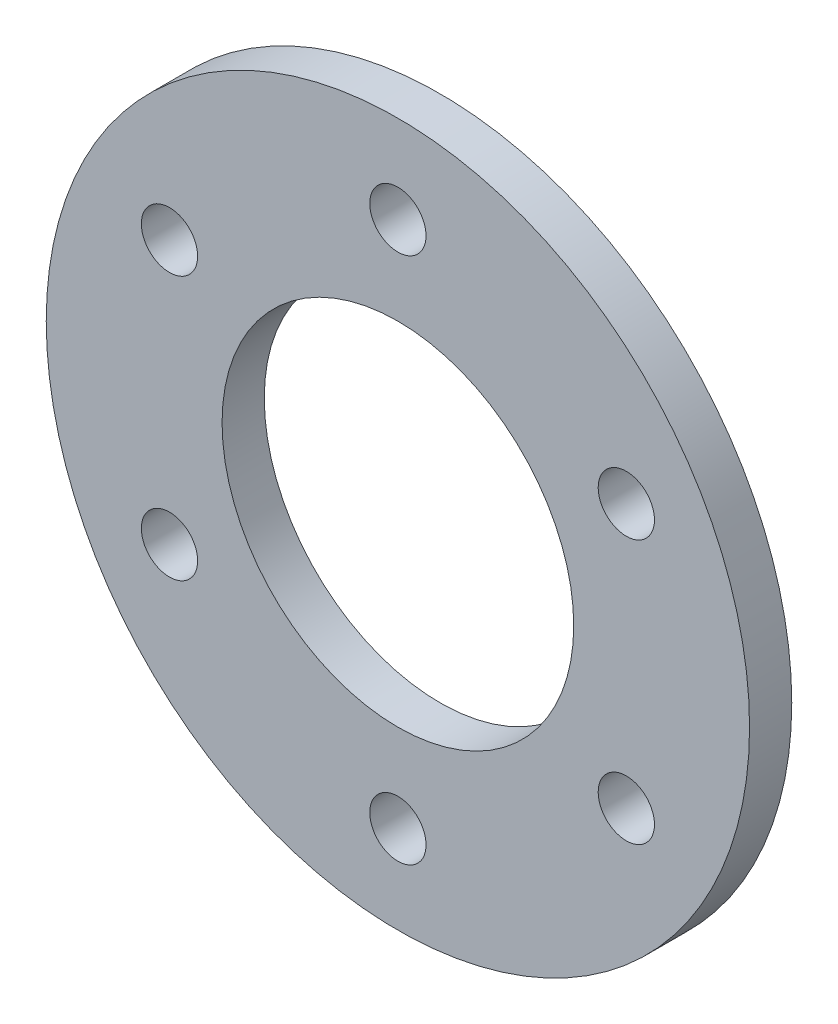
ISO-10303-21;
HEADER;
FILE_DESCRIPTION(('STEP AP214'),'2;1');
FILE_NAME('part.step','',(''),(''),'','','');
FILE_SCHEMA(('AUTOMOTIVE_DESIGN { 1 0 10303 214 1 1 1 1 }'));
ENDSEC;
DATA;
#1=APPLICATION_CONTEXT('core data for automotive mechanical design processes');
#2=APPLICATION_PROTOCOL_DEFINITION('international standard','automotive_design',2000,#1);
#3=PRODUCT_CONTEXT('',#1,'mechanical');
#4=PRODUCT('Part','Part','',(#3));
#5=PRODUCT_RELATED_PRODUCT_CATEGORY('part','',(#4));
#6=PRODUCT_DEFINITION_FORMATION('','',#4);
#7=PRODUCT_DEFINITION_CONTEXT('part definition',#1,'design');
#8=PRODUCT_DEFINITION('design','',#6,#7);
#9=PRODUCT_DEFINITION_SHAPE('','',#8);
#10=(LENGTH_UNIT() NAMED_UNIT(*) SI_UNIT(.MILLI.,.METRE.));
#11=(NAMED_UNIT(*) PLANE_ANGLE_UNIT() SI_UNIT($,.RADIAN.));
#12=(NAMED_UNIT(*) SI_UNIT($,.STERADIAN.) SOLID_ANGLE_UNIT());
#13=UNCERTAINTY_MEASURE_WITH_UNIT(LENGTH_MEASURE(1.E-05),#10,'distance_accuracy_value','');
#14=(GEOMETRIC_REPRESENTATION_CONTEXT(3) GLOBAL_UNCERTAINTY_ASSIGNED_CONTEXT((#13)) GLOBAL_UNIT_ASSIGNED_CONTEXT((#10,
#11,#12)) REPRESENTATION_CONTEXT('',''));
#15=CARTESIAN_POINT('',(0.,0.,0.));
#16=DIRECTION('',(0.,0.,1.));
#17=DIRECTION('',(1.,0.,0.));
#18=AXIS2_PLACEMENT_3D('',#15,#16,#17);
#19=CARTESIAN_POINT('',(0.,0.,3.));
#20=DIRECTION('',(0.,0.,-1.));
#21=DIRECTION('',(-1.,0.,0.));
#22=AXIS2_PLACEMENT_3D('',#19,#20,#21);
#23=CYLINDRICAL_SURFACE('',#22,25.);
#24=CARTESIAN_POINT('',(0.,0.,3.));
#25=DIRECTION('',(0.,0.,1.));
#26=DIRECTION('',(1.,0.,0.));
#27=AXIS2_PLACEMENT_3D('',#24,#25,#26);
#28=CIRCLE('',#27,25.);
#29=CARTESIAN_POINT('',(25.,0.,3.));
#30=VERTEX_POINT('',#29);
#31=EDGE_CURVE('E10',#30,#30,#28,.T.);
#32=ORIENTED_EDGE('',*,*,#31,.F.);
#33=EDGE_LOOP('',(#32));
#34=FACE_BOUND('',#33,.T.);
#35=CARTESIAN_POINT('',(0.,0.,0.));
#36=DIRECTION('',(0.,0.,1.));
#37=DIRECTION('',(1.,0.,0.));
#38=AXIS2_PLACEMENT_3D('',#35,#36,#37);
#39=CIRCLE('',#38,25.);
#40=CARTESIAN_POINT('',(25.,0.,0.));
#41=VERTEX_POINT('',#40);
#42=EDGE_CURVE('E38',#41,#41,#39,.T.);
#43=ORIENTED_EDGE('',*,*,#42,.T.);
#44=EDGE_LOOP('',(#43));
#45=FACE_BOUND('',#44,.T.);
#46=ADVANCED_FACE('F35',(#34,#45),#23,.T.);
#47=CARTESIAN_POINT('',(0.,0.,3.));
#48=DIRECTION('',(0.,0.,1.));
#49=DIRECTION('',(1.,0.,0.));
#50=AXIS2_PLACEMENT_3D('',#47,#48,#49);
#51=PLANE('',#50);
#52=CARTESIAN_POINT('',(0.,18.75,3.));
#53=DIRECTION('',(0.,0.,1.));
#54=DIRECTION('',(1.,0.,0.));
#55=AXIS2_PLACEMENT_3D('',#52,#53,#54);
#56=CIRCLE('',#55,2.);
#57=CARTESIAN_POINT('',(2.,18.75,3.));
#58=VERTEX_POINT('',#57);
#59=EDGE_CURVE('E52',#58,#58,#56,.T.);
#60=ORIENTED_EDGE('',*,*,#59,.F.);
#61=EDGE_LOOP('',(#60));
#62=FACE_BOUND('',#61,.T.);
#63=CARTESIAN_POINT('',(16.2379763209581,9.37500000000019,3.));
#64=DIRECTION('',(0.,0.,1.));
#65=DIRECTION('',(1.,0.,0.));
#66=AXIS2_PLACEMENT_3D('',#63,#64,#65);
#67=CIRCLE('',#66,2.);
#68=CARTESIAN_POINT('',(18.2379763209581,9.37500000000019,3.));
#69=VERTEX_POINT('',#68);
#70=EDGE_CURVE('E55',#69,#69,#67,.T.);
#71=ORIENTED_EDGE('',*,*,#70,.F.);
#72=EDGE_LOOP('',(#71));
#73=FACE_BOUND('',#72,.T.);
#74=CARTESIAN_POINT('',(16.2379763209583,-9.37499999999985,3.));
#75=DIRECTION('',(0.,0.,1.));
#76=DIRECTION('',(1.,0.,0.));
#77=AXIS2_PLACEMENT_3D('',#74,#75,#76);
#78=CIRCLE('',#77,2.);
#79=CARTESIAN_POINT('',(18.2379763209583,-9.37499999999985,3.));
#80=VERTEX_POINT('',#79);
#81=EDGE_CURVE('E58',#80,#80,#78,.T.);
#82=ORIENTED_EDGE('',*,*,#81,.F.);
#83=EDGE_LOOP('',(#82));
#84=FACE_BOUND('',#83,.T.);
#85=CARTESIAN_POINT('',(1.30930550206618E-13,-18.75,3.));
#86=DIRECTION('',(0.,0.,1.));
#87=DIRECTION('',(1.,0.,0.));
#88=AXIS2_PLACEMENT_3D('',#85,#86,#87);
#89=CIRCLE('',#88,2.);
#90=CARTESIAN_POINT('',(2.00000000000013,-18.75,3.));
#91=VERTEX_POINT('',#90);
#92=EDGE_CURVE('E61',#91,#91,#89,.T.);
#93=ORIENTED_EDGE('',*,*,#92,.F.);
#94=EDGE_LOOP('',(#93));
#95=FACE_BOUND('',#94,.T.);
#96=CARTESIAN_POINT('',(-16.2379763209582,-9.37500000000008,3.));
#97=DIRECTION('',(0.,0.,1.));
#98=DIRECTION('',(1.,0.,0.));
#99=AXIS2_PLACEMENT_3D('',#96,#97,#98);
#100=CIRCLE('',#99,2.);
#101=CARTESIAN_POINT('',(-14.2379763209582,-9.37500000000008,3.));
#102=VERTEX_POINT('',#101);
#103=EDGE_CURVE('E64',#102,#102,#100,.T.);
#104=ORIENTED_EDGE('',*,*,#103,.F.);
#105=EDGE_LOOP('',(#104));
#106=FACE_BOUND('',#105,.T.);
#107=CARTESIAN_POINT('',(-16.2379763209582,9.37499999999996,3.));
#108=DIRECTION('',(0.,0.,1.));
#109=DIRECTION('',(1.,0.,0.));
#110=AXIS2_PLACEMENT_3D('',#107,#108,#109);
#111=CIRCLE('',#110,2.);
#112=CARTESIAN_POINT('',(-14.2379763209582,9.37499999999996,3.));
#113=VERTEX_POINT('',#112);
#114=EDGE_CURVE('E67',#113,#113,#111,.T.);
#115=ORIENTED_EDGE('',*,*,#114,.F.);
#116=EDGE_LOOP('',(#115));
#117=FACE_BOUND('',#116,.T.);
#118=CARTESIAN_POINT('',(0.,0.,3.));
#119=DIRECTION('',(0.,0.,1.));
#120=DIRECTION('',(1.,0.,0.));
#121=AXIS2_PLACEMENT_3D('',#118,#119,#120);
#122=CIRCLE('',#121,12.5);
#123=CARTESIAN_POINT('',(12.5,0.,3.));
#124=VERTEX_POINT('',#123);
#125=EDGE_CURVE('E45',#124,#124,#122,.T.);
#126=ORIENTED_EDGE('',*,*,#125,.F.);
#127=EDGE_LOOP('',(#126));
#128=FACE_BOUND('',#127,.T.);
#129=ORIENTED_EDGE('',*,*,#31,.T.);
#130=EDGE_LOOP('',(#129));
#131=FACE_BOUND('',#130,.T.);
#132=ADVANCED_FACE('F95',(#62,#73,#84,#95,#106,#117,#128,#131),#51,.T.);
#133=CARTESIAN_POINT('',(0.,0.,0.));
#134=DIRECTION('',(0.,0.,1.));
#135=DIRECTION('',(1.,0.,0.));
#136=AXIS2_PLACEMENT_3D('',#133,#134,#135);
#137=PLANE('',#136);
#138=CARTESIAN_POINT('',(0.,18.75,0.));
#139=DIRECTION('',(0.,0.,-1.));
#140=DIRECTION('',(-1.,0.,0.));
#141=AXIS2_PLACEMENT_3D('',#138,#139,#140);
#142=CIRCLE('',#141,2.);
#143=CARTESIAN_POINT('',(-2.,18.75,0.));
#144=VERTEX_POINT('',#143);
#145=EDGE_CURVE('E70',#144,#144,#142,.T.);
#146=ORIENTED_EDGE('',*,*,#145,.F.);
#147=EDGE_LOOP('',(#146));
#148=FACE_BOUND('',#147,.T.);
#149=CARTESIAN_POINT('',(16.2379763209581,9.37500000000019,0.));
#150=DIRECTION('',(0.,0.,-1.));
#151=DIRECTION('',(-1.,0.,0.));
#152=AXIS2_PLACEMENT_3D('',#149,#150,#151);
#153=CIRCLE('',#152,2.);
#154=CARTESIAN_POINT('',(14.2379763209581,9.37500000000019,0.));
#155=VERTEX_POINT('',#154);
#156=EDGE_CURVE('E75',#155,#155,#153,.T.);
#157=ORIENTED_EDGE('',*,*,#156,.F.);
#158=EDGE_LOOP('',(#157));
#159=FACE_BOUND('',#158,.T.);
#160=CARTESIAN_POINT('',(16.2379763209583,-9.37499999999985,0.));
#161=DIRECTION('',(0.,0.,-1.));
#162=DIRECTION('',(-1.,0.,0.));
#163=AXIS2_PLACEMENT_3D('',#160,#161,#162);
#164=CIRCLE('',#163,2.);
#165=CARTESIAN_POINT('',(14.2379763209583,-9.37499999999985,0.));
#166=VERTEX_POINT('',#165);
#167=EDGE_CURVE('E71',#166,#166,#164,.T.);
#168=ORIENTED_EDGE('',*,*,#167,.F.);
#169=EDGE_LOOP('',(#168));
#170=FACE_BOUND('',#169,.T.);
#171=CARTESIAN_POINT('',(1.30930550206618E-13,-18.75,0.));
#172=DIRECTION('',(0.,0.,-1.));
#173=DIRECTION('',(-1.,0.,0.));
#174=AXIS2_PLACEMENT_3D('',#171,#172,#173);
#175=CIRCLE('',#174,2.);
#176=CARTESIAN_POINT('',(-1.99999999999987,-18.75,0.));
#177=VERTEX_POINT('',#176);
#178=EDGE_CURVE('E74',#177,#177,#175,.T.);
#179=ORIENTED_EDGE('',*,*,#178,.F.);
#180=EDGE_LOOP('',(#179));
#181=FACE_BOUND('',#180,.T.);
#182=CARTESIAN_POINT('',(-16.2379763209582,-9.37500000000008,0.));
#183=DIRECTION('',(0.,0.,-1.));
#184=DIRECTION('',(-1.,0.,0.));
#185=AXIS2_PLACEMENT_3D('',#182,#183,#184);
#186=CIRCLE('',#185,2.);
#187=CARTESIAN_POINT('',(-18.2379763209582,-9.37500000000008,0.));
#188=VERTEX_POINT('',#187);
#189=EDGE_CURVE('E78',#188,#188,#186,.T.);
#190=ORIENTED_EDGE('',*,*,#189,.F.);
#191=EDGE_LOOP('',(#190));
#192=FACE_BOUND('',#191,.T.);
#193=CARTESIAN_POINT('',(-16.2379763209582,9.37499999999996,0.));
#194=DIRECTION('',(0.,0.,-1.));
#195=DIRECTION('',(-1.,0.,0.));
#196=AXIS2_PLACEMENT_3D('',#193,#194,#195);
#197=CIRCLE('',#196,2.);
#198=CARTESIAN_POINT('',(-18.2379763209582,9.37499999999996,0.));
#199=VERTEX_POINT('',#198);
#200=EDGE_CURVE('E81',#199,#199,#197,.T.);
#201=ORIENTED_EDGE('',*,*,#200,.F.);
#202=EDGE_LOOP('',(#201));
#203=FACE_BOUND('',#202,.T.);
#204=CARTESIAN_POINT('',(0.,0.,0.));
#205=DIRECTION('',(0.,0.,-1.));
#206=DIRECTION('',(-1.,0.,0.));
#207=AXIS2_PLACEMENT_3D('',#204,#205,#206);
#208=CIRCLE('',#207,12.5);
#209=CARTESIAN_POINT('',(-12.5,0.,0.));
#210=VERTEX_POINT('',#209);
#211=EDGE_CURVE('E49',#210,#210,#208,.T.);
#212=ORIENTED_EDGE('',*,*,#211,.F.);
#213=EDGE_LOOP('',(#212));
#214=FACE_BOUND('',#213,.T.);
#215=ORIENTED_EDGE('',*,*,#42,.F.);
#216=EDGE_LOOP('',(#215));
#217=FACE_BOUND('',#216,.T.);
#218=ADVANCED_FACE('F91',(#148,#159,#170,#181,#192,#203,#214,#217),#137,.F.);
#219=CARTESIAN_POINT('',(0.,0.,8.2));
#220=DIRECTION('',(0.,0.,-1.));
#221=DIRECTION('',(-1.,0.,0.));
#222=AXIS2_PLACEMENT_3D('',#219,#220,#221);
#223=CYLINDRICAL_SURFACE('',#222,12.5);
#224=ORIENTED_EDGE('',*,*,#125,.T.);
#225=EDGE_LOOP('',(#224));
#226=FACE_BOUND('',#225,.T.);
#227=ORIENTED_EDGE('',*,*,#211,.T.);
#228=EDGE_LOOP('',(#227));
#229=FACE_BOUND('',#228,.T.);
#230=ADVANCED_FACE('F94',(#226,#229),#223,.F.);
#231=CARTESIAN_POINT('',(-16.2379763209582,9.37499999999996,10.));
#232=DIRECTION('',(0.,0.,-1.));
#233=DIRECTION('',(-1.,0.,0.));
#234=AXIS2_PLACEMENT_3D('',#231,#232,#233);
#235=CYLINDRICAL_SURFACE('',#234,2.);
#236=ORIENTED_EDGE('',*,*,#114,.T.);
#237=EDGE_LOOP('',(#236));
#238=FACE_BOUND('',#237,.T.);
#239=ORIENTED_EDGE('',*,*,#200,.T.);
#240=EDGE_LOOP('',(#239));
#241=FACE_BOUND('',#240,.T.);
#242=ADVANCED_FACE('F124',(#238,#241),#235,.F.);
#243=CARTESIAN_POINT('',(-16.2379763209582,-9.37500000000008,10.));
#244=DIRECTION('',(0.,0.,-1.));
#245=DIRECTION('',(-1.,0.,0.));
#246=AXIS2_PLACEMENT_3D('',#243,#244,#245);
#247=CYLINDRICAL_SURFACE('',#246,2.);
#248=ORIENTED_EDGE('',*,*,#103,.T.);
#249=EDGE_LOOP('',(#248));
#250=FACE_BOUND('',#249,.T.);
#251=ORIENTED_EDGE('',*,*,#189,.T.);
#252=EDGE_LOOP('',(#251));
#253=FACE_BOUND('',#252,.T.);
#254=ADVANCED_FACE('F134',(#250,#253),#247,.F.);
#255=CARTESIAN_POINT('',(1.30930550206618E-13,-18.75,10.));
#256=DIRECTION('',(0.,0.,-1.));
#257=DIRECTION('',(-1.,0.,0.));
#258=AXIS2_PLACEMENT_3D('',#255,#256,#257);
#259=CYLINDRICAL_SURFACE('',#258,2.);
#260=ORIENTED_EDGE('',*,*,#92,.T.);
#261=EDGE_LOOP('',(#260));
#262=FACE_BOUND('',#261,.T.);
#263=ORIENTED_EDGE('',*,*,#178,.T.);
#264=EDGE_LOOP('',(#263));
#265=FACE_BOUND('',#264,.T.);
#266=ADVANCED_FACE('F130',(#262,#265),#259,.F.);
#267=CARTESIAN_POINT('',(16.2379763209583,-9.37499999999985,10.));
#268=DIRECTION('',(0.,0.,-1.));
#269=DIRECTION('',(-1.,0.,0.));
#270=AXIS2_PLACEMENT_3D('',#267,#268,#269);
#271=CYLINDRICAL_SURFACE('',#270,2.);
#272=ORIENTED_EDGE('',*,*,#81,.T.);
#273=EDGE_LOOP('',(#272));
#274=FACE_BOUND('',#273,.T.);
#275=ORIENTED_EDGE('',*,*,#167,.T.);
#276=EDGE_LOOP('',(#275));
#277=FACE_BOUND('',#276,.T.);
#278=ADVANCED_FACE('F126',(#274,#277),#271,.F.);
#279=CARTESIAN_POINT('',(16.2379763209581,9.37500000000019,10.));
#280=DIRECTION('',(0.,0.,-1.));
#281=DIRECTION('',(-1.,0.,0.));
#282=AXIS2_PLACEMENT_3D('',#279,#280,#281);
#283=CYLINDRICAL_SURFACE('',#282,2.);
#284=ORIENTED_EDGE('',*,*,#70,.T.);
#285=EDGE_LOOP('',(#284));
#286=FACE_BOUND('',#285,.T.);
#287=ORIENTED_EDGE('',*,*,#156,.T.);
#288=EDGE_LOOP('',(#287));
#289=FACE_BOUND('',#288,.T.);
#290=ADVANCED_FACE('F129',(#286,#289),#283,.F.);
#291=CARTESIAN_POINT('',(0.,18.75,10.));
#292=DIRECTION('',(0.,0.,-1.));
#293=DIRECTION('',(-1.,0.,0.));
#294=AXIS2_PLACEMENT_3D('',#291,#292,#293);
#295=CYLINDRICAL_SURFACE('',#294,2.);
#296=ORIENTED_EDGE('',*,*,#59,.T.);
#297=EDGE_LOOP('',(#296));
#298=FACE_BOUND('',#297,.T.);
#299=ORIENTED_EDGE('',*,*,#145,.T.);
#300=EDGE_LOOP('',(#299));
#301=FACE_BOUND('',#300,.T.);
#302=ADVANCED_FACE('F89',(#298,#301),#295,.F.);
#303=CLOSED_SHELL('',(#46,#132,#218,#230,#242,#254,#266,#278,#290,#302));
#304=MANIFOLD_SOLID_BREP('B2',#303);
#305=ADVANCED_BREP_SHAPE_REPRESENTATION('',(#18,#304),#14);
#306=SHAPE_DEFINITION_REPRESENTATION(#9,#305);
ENDSEC;
END-ISO-10303-21;
